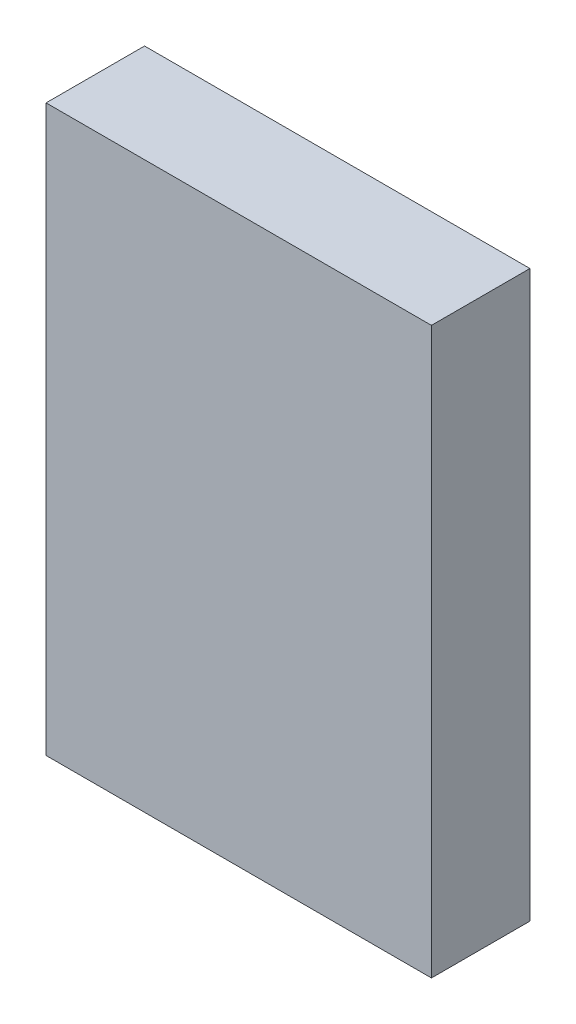
ISO-10303-21;
HEADER;
FILE_DESCRIPTION(('STEP AP214'),'2;1');
FILE_NAME('part.step','',(''),(''),'','','');
FILE_SCHEMA(('AUTOMOTIVE_DESIGN { 1 0 10303 214 1 1 1 1 }'));
ENDSEC;
DATA;
#1=APPLICATION_CONTEXT('core data for automotive mechanical design processes');
#2=APPLICATION_PROTOCOL_DEFINITION('international standard','automotive_design',2000,#1);
#3=PRODUCT_CONTEXT('',#1,'mechanical');
#4=PRODUCT('Part','Part','',(#3));
#5=PRODUCT_RELATED_PRODUCT_CATEGORY('part','',(#4));
#6=PRODUCT_DEFINITION_FORMATION('','',#4);
#7=PRODUCT_DEFINITION_CONTEXT('part definition',#1,'design');
#8=PRODUCT_DEFINITION('design','',#6,#7);
#9=PRODUCT_DEFINITION_SHAPE('','',#8);
#10=(LENGTH_UNIT() NAMED_UNIT(*) SI_UNIT(.MILLI.,.METRE.));
#11=(NAMED_UNIT(*) PLANE_ANGLE_UNIT() SI_UNIT($,.RADIAN.));
#12=(NAMED_UNIT(*) SI_UNIT($,.STERADIAN.) SOLID_ANGLE_UNIT());
#13=UNCERTAINTY_MEASURE_WITH_UNIT(LENGTH_MEASURE(1.E-05),#10,'distance_accuracy_value','');
#14=(GEOMETRIC_REPRESENTATION_CONTEXT(3) GLOBAL_UNCERTAINTY_ASSIGNED_CONTEXT((#13)) GLOBAL_UNIT_ASSIGNED_CONTEXT((#10,
#11,#12)) REPRESENTATION_CONTEXT('',''));
#15=CARTESIAN_POINT('',(0.,0.,0.));
#16=DIRECTION('',(0.,0.,1.));
#17=DIRECTION('',(1.,0.,0.));
#18=AXIS2_PLACEMENT_3D('',#15,#16,#17);
#19=CARTESIAN_POINT('',(1.270000005636E-06,1.269999998515E-06,1.15000024));
#20=DIRECTION('',(0.,0.,-1.));
#21=DIRECTION('',(-1.,0.,0.));
#22=AXIS2_PLACEMENT_3D('',#19,#20,#21);
#23=PLANE('',#22);
#24=DIRECTION('',(0.,1.,0.));
#25=VECTOR('',#24,1.);
#26=CARTESIAN_POINT('',(-2.24999804,-3.29999848,1.15000024));
#27=LINE('',#26,#25);
#28=CARTESIAN_POINT('',(-2.24999804,-3.29999848,1.15000024));
#29=VERTEX_POINT('',#28);
#30=CARTESIAN_POINT('',(-2.24999804,3.30000102,1.15000024));
#31=VERTEX_POINT('',#30);
#32=EDGE_CURVE('E68',#29,#31,#27,.T.);
#33=ORIENTED_EDGE('',*,*,#32,.F.);
#34=DIRECTION('',(1.,0.,0.));
#35=VECTOR('',#34,1.);
#36=CARTESIAN_POINT('',(2.25000058,-3.29999848,1.15000024));
#37=LINE('',#36,#35);
#38=CARTESIAN_POINT('',(2.25000058,-3.29999848,1.15000024));
#39=VERTEX_POINT('',#38);
#40=EDGE_CURVE('E55',#39,#29,#37,.F.);
#41=ORIENTED_EDGE('',*,*,#40,.F.);
#42=DIRECTION('',(0.,1.,0.));
#43=VECTOR('',#42,1.);
#44=CARTESIAN_POINT('',(2.25000058,3.30000102,1.15000024));
#45=LINE('',#44,#43);
#46=CARTESIAN_POINT('',(2.25000058,3.30000102,1.15000024));
#47=VERTEX_POINT('',#46);
#48=EDGE_CURVE('E20',#47,#39,#45,.F.);
#49=ORIENTED_EDGE('',*,*,#48,.F.);
#50=DIRECTION('',(1.,0.,0.));
#51=VECTOR('',#50,1.);
#52=CARTESIAN_POINT('',(-2.24999804,3.30000102,1.15000024));
#53=LINE('',#52,#51);
#54=EDGE_CURVE('E80',#31,#47,#53,.T.);
#55=ORIENTED_EDGE('',*,*,#54,.F.);
#56=EDGE_LOOP('',(#33,#41,#49,#55));
#57=FACE_BOUND('',#56,.T.);
#58=ADVANCED_FACE('F17',(#57),#23,.F.);
#59=CARTESIAN_POINT('',(2.25000058,3.30000102,0.));
#60=DIRECTION('',(1.,0.,0.));
#61=DIRECTION('',(0.,0.,-1.));
#62=AXIS2_PLACEMENT_3D('',#59,#60,#61);
#63=PLANE('',#62);
#64=DIRECTION('',(0.,0.,-1.));
#65=VECTOR('',#64,1.);
#66=CARTESIAN_POINT('',(2.25000058,-3.29999848,0.));
#67=LINE('',#66,#65);
#68=CARTESIAN_POINT('',(2.25000058,-3.29999848,0.));
#69=VERTEX_POINT('',#68);
#70=EDGE_CURVE('E61',#69,#39,#67,.F.);
#71=ORIENTED_EDGE('',*,*,#70,.F.);
#72=DIRECTION('',(0.,1.,0.));
#73=VECTOR('',#72,1.);
#74=CARTESIAN_POINT('',(2.25000058,1.269999998515E-06,0.));
#75=LINE('',#74,#73);
#76=CARTESIAN_POINT('',(2.25000058,3.30000102,0.));
#77=VERTEX_POINT('',#76);
#78=EDGE_CURVE('E83',#77,#69,#75,.F.);
#79=ORIENTED_EDGE('',*,*,#78,.F.);
#80=DIRECTION('',(0.,0.,1.));
#81=VECTOR('',#80,1.);
#82=CARTESIAN_POINT('',(2.25000058,3.30000102,0.));
#83=LINE('',#82,#81);
#84=EDGE_CURVE('E64',#47,#77,#83,.F.);
#85=ORIENTED_EDGE('',*,*,#84,.F.);
#86=ORIENTED_EDGE('',*,*,#48,.T.);
#87=EDGE_LOOP('',(#71,#79,#85,#86));
#88=FACE_BOUND('',#87,.T.);
#89=ADVANCED_FACE('F60',(#88),#63,.T.);
#90=CARTESIAN_POINT('',(2.25000058,-3.29999848,0.));
#91=DIRECTION('',(0.,-1.,0.));
#92=DIRECTION('',(0.,0.,-1.));
#93=AXIS2_PLACEMENT_3D('',#90,#91,#92);
#94=PLANE('',#93);
#95=DIRECTION('',(0.,0.,1.));
#96=VECTOR('',#95,1.);
#97=CARTESIAN_POINT('',(-2.24999804,-3.29999848,0.));
#98=LINE('',#97,#96);
#99=CARTESIAN_POINT('',(-2.24999804,-3.29999848,0.));
#100=VERTEX_POINT('',#99);
#101=EDGE_CURVE('E70',#100,#29,#98,.T.);
#102=ORIENTED_EDGE('',*,*,#101,.F.);
#103=DIRECTION('',(-1.,0.,0.));
#104=VECTOR('',#103,1.);
#105=CARTESIAN_POINT('',(1.270000005636E-06,-3.29999848,0.));
#106=LINE('',#105,#104);
#107=EDGE_CURVE('E74',#69,#100,#106,.T.);
#108=ORIENTED_EDGE('',*,*,#107,.F.);
#109=ORIENTED_EDGE('',*,*,#70,.T.);
#110=ORIENTED_EDGE('',*,*,#40,.T.);
#111=EDGE_LOOP('',(#102,#108,#109,#110));
#112=FACE_BOUND('',#111,.T.);
#113=ADVANCED_FACE('F72',(#112),#94,.T.);
#114=CARTESIAN_POINT('',(-2.24999804,-3.29999848,0.));
#115=DIRECTION('',(-1.,0.,0.));
#116=DIRECTION('',(0.,0.,1.));
#117=AXIS2_PLACEMENT_3D('',#114,#115,#116);
#118=PLANE('',#117);
#119=DIRECTION('',(0.,0.,1.));
#120=VECTOR('',#119,1.);
#121=CARTESIAN_POINT('',(-2.24999804,3.30000102,0.));
#122=LINE('',#121,#120);
#123=CARTESIAN_POINT('',(-2.24999804,3.30000102,0.));
#124=VERTEX_POINT('',#123);
#125=EDGE_CURVE('E35',#124,#31,#122,.T.);
#126=ORIENTED_EDGE('',*,*,#125,.F.);
#127=DIRECTION('',(0.,1.,0.));
#128=VECTOR('',#127,1.);
#129=CARTESIAN_POINT('',(-2.24999804,1.269999998515E-06,0.));
#130=LINE('',#129,#128);
#131=EDGE_CURVE('E26',#100,#124,#130,.T.);
#132=ORIENTED_EDGE('',*,*,#131,.F.);
#133=ORIENTED_EDGE('',*,*,#101,.T.);
#134=ORIENTED_EDGE('',*,*,#32,.T.);
#135=EDGE_LOOP('',(#126,#132,#133,#134));
#136=FACE_BOUND('',#135,.T.);
#137=ADVANCED_FACE('F89',(#136),#118,.T.);
#138=CARTESIAN_POINT('',(-2.24999804,3.30000102,0.));
#139=DIRECTION('',(0.,1.,0.));
#140=DIRECTION('',(0.,0.,1.));
#141=AXIS2_PLACEMENT_3D('',#138,#139,#140);
#142=PLANE('',#141);
#143=ORIENTED_EDGE('',*,*,#84,.T.);
#144=DIRECTION('',(-1.,0.,0.));
#145=VECTOR('',#144,1.);
#146=CARTESIAN_POINT('',(1.270000005636E-06,3.30000102,0.));
#147=LINE('',#146,#145);
#148=EDGE_CURVE('E11',#124,#77,#147,.F.);
#149=ORIENTED_EDGE('',*,*,#148,.F.);
#150=ORIENTED_EDGE('',*,*,#125,.T.);
#151=ORIENTED_EDGE('',*,*,#54,.T.);
#152=EDGE_LOOP('',(#143,#149,#150,#151));
#153=FACE_BOUND('',#152,.T.);
#154=ADVANCED_FACE('F91',(#153),#142,.T.);
#155=CARTESIAN_POINT('',(1.270000005636E-06,1.269999998515E-06,0.));
#156=DIRECTION('',(0.,0.,-1.));
#157=DIRECTION('',(-1.,0.,0.));
#158=AXIS2_PLACEMENT_3D('',#155,#156,#157);
#159=PLANE('',#158);
#160=ORIENTED_EDGE('',*,*,#131,.T.);
#161=ORIENTED_EDGE('',*,*,#148,.T.);
#162=ORIENTED_EDGE('',*,*,#78,.T.);
#163=ORIENTED_EDGE('',*,*,#107,.T.);
#164=EDGE_LOOP('',(#160,#161,#162,#163));
#165=FACE_BOUND('',#164,.T.);
#166=ADVANCED_FACE('F88',(#165),#159,.T.);
#167=CLOSED_SHELL('',(#58,#89,#113,#137,#154,#166));
#168=MANIFOLD_SOLID_BREP('B1',#167);
#169=ADVANCED_BREP_SHAPE_REPRESENTATION('',(#18,#168),#14);
#170=SHAPE_DEFINITION_REPRESENTATION(#9,#169);
ENDSEC;
END-ISO-10303-21;
